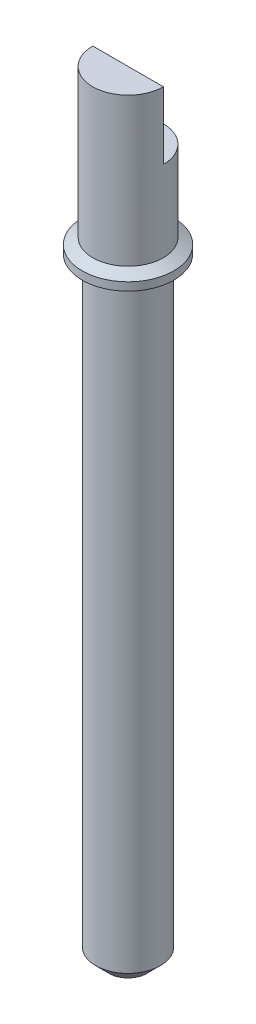
ISO-10303-21;
HEADER;
FILE_DESCRIPTION(('STEP AP214'),'2;1');
FILE_NAME('part.step','',(''),(''),'','','');
FILE_SCHEMA(('AUTOMOTIVE_DESIGN { 1 0 10303 214 1 1 1 1 }'));
ENDSEC;
DATA;
#1=APPLICATION_CONTEXT('core data for automotive mechanical design processes');
#2=APPLICATION_PROTOCOL_DEFINITION('international standard','automotive_design',2000,#1);
#3=PRODUCT_CONTEXT('',#1,'mechanical');
#4=PRODUCT('Part','Part','',(#3));
#5=PRODUCT_RELATED_PRODUCT_CATEGORY('part','',(#4));
#6=PRODUCT_DEFINITION_FORMATION('','',#4);
#7=PRODUCT_DEFINITION_CONTEXT('part definition',#1,'design');
#8=PRODUCT_DEFINITION('design','',#6,#7);
#9=PRODUCT_DEFINITION_SHAPE('','',#8);
#10=(LENGTH_UNIT() NAMED_UNIT(*) SI_UNIT(.MILLI.,.METRE.));
#11=(NAMED_UNIT(*) PLANE_ANGLE_UNIT() SI_UNIT($,.RADIAN.));
#12=(NAMED_UNIT(*) SI_UNIT($,.STERADIAN.) SOLID_ANGLE_UNIT());
#13=UNCERTAINTY_MEASURE_WITH_UNIT(LENGTH_MEASURE(1.E-05),#10,'distance_accuracy_value','');
#14=(GEOMETRIC_REPRESENTATION_CONTEXT(3) GLOBAL_UNCERTAINTY_ASSIGNED_CONTEXT((#13)) GLOBAL_UNIT_ASSIGNED_CONTEXT((#10,
#11,#12)) REPRESENTATION_CONTEXT('',''));
#15=CARTESIAN_POINT('',(0.,0.,0.));
#16=DIRECTION('',(0.,0.,1.));
#17=DIRECTION('',(1.,0.,0.));
#18=AXIS2_PLACEMENT_3D('',#15,#16,#17);
#19=CARTESIAN_POINT('',(0.,24.38641432653,0.));
#20=DIRECTION('',(0.,1.,0.));
#21=DIRECTION('',(0.,0.,1.));
#22=AXIS2_PLACEMENT_3D('',#19,#20,#21);
#23=CONICAL_SURFACE('',#22,0.6,1.04719755119661);
#24=CARTESIAN_POINT('',(0.,24.5307518938274,0.));
#25=DIRECTION('',(0.,-1.,0.));
#26=DIRECTION('',(0.,0.,-1.));
#27=AXIS2_PLACEMENT_3D('',#24,#25,#26);
#28=CIRCLE('',#27,0.85);
#29=CARTESIAN_POINT('',(0.,24.5307518938274,-0.85));
#30=VERTEX_POINT('',#29);
#31=EDGE_CURVE('E11',#30,#30,#28,.T.);
#32=ORIENTED_EDGE('',*,*,#31,.T.);
#33=EDGE_LOOP('',(#32));
#34=FACE_BOUND('',#33,.T.);
#35=CARTESIAN_POINT('',(0.,24.38641432653,0.));
#36=DIRECTION('',(0.,-1.,0.));
#37=DIRECTION('',(0.,0.,-1.));
#38=AXIS2_PLACEMENT_3D('',#35,#36,#37);
#39=CIRCLE('',#38,0.6);
#40=CARTESIAN_POINT('',(0.,24.38641432653,-0.6));
#41=VERTEX_POINT('',#40);
#42=EDGE_CURVE('E391',#41,#41,#39,.T.);
#43=ORIENTED_EDGE('',*,*,#42,.F.);
#44=EDGE_LOOP('',(#43));
#45=FACE_BOUND('',#44,.T.);
#46=ADVANCED_FACE('F354',(#34,#45),#23,.T.);
#47=CARTESIAN_POINT('',(0.,0.,0.));
#48=DIRECTION('',(0.,-1.,0.));
#49=DIRECTION('',(0.,0.,-1.));
#50=AXIS2_PLACEMENT_3D('',#47,#48,#49);
#51=CYLINDRICAL_SURFACE('',#50,0.85);
#52=CARTESIAN_POINT('',(0.,24.6807518938274,0.));
#53=DIRECTION('',(0.,-1.,0.));
#54=DIRECTION('',(0.,0.,-1.));
#55=AXIS2_PLACEMENT_3D('',#52,#53,#54);
#56=CIRCLE('',#55,0.85);
#57=CARTESIAN_POINT('',(0.,24.6807518938274,-0.85));
#58=VERTEX_POINT('',#57);
#59=EDGE_CURVE('E361',#58,#58,#56,.T.);
#60=ORIENTED_EDGE('',*,*,#59,.T.);
#61=EDGE_LOOP('',(#60));
#62=FACE_BOUND('',#61,.T.);
#63=ORIENTED_EDGE('',*,*,#31,.F.);
#64=EDGE_LOOP('',(#63));
#65=FACE_BOUND('',#64,.T.);
#66=ADVANCED_FACE('F406',(#62,#65),#51,.T.);
#67=CARTESIAN_POINT('',(0.,24.6807518938274,0.));
#68=DIRECTION('',(0.,-1.,0.));
#69=DIRECTION('',(0.,0.,-1.));
#70=AXIS2_PLACEMENT_3D('',#67,#68,#69);
#71=CONICAL_SURFACE('',#70,0.85,1.0471975511966);
#72=CARTESIAN_POINT('',(0.,24.7933351963194,0.));
#73=DIRECTION('',(0.,-1.,0.));
#74=DIRECTION('',(0.,0.,-1.));
#75=AXIS2_PLACEMENT_3D('',#72,#73,#74);
#76=CIRCLE('',#75,0.655);
#77=CARTESIAN_POINT('',(0.,24.7933351963194,-0.655));
#78=VERTEX_POINT('',#77);
#79=EDGE_CURVE('E394',#78,#78,#76,.T.);
#80=ORIENTED_EDGE('',*,*,#79,.T.);
#81=EDGE_LOOP('',(#80));
#82=FACE_BOUND('',#81,.T.);
#83=ORIENTED_EDGE('',*,*,#59,.F.);
#84=EDGE_LOOP('',(#83));
#85=FACE_BOUND('',#84,.T.);
#86=ADVANCED_FACE('F409',(#82,#85),#71,.T.);
#87=CARTESIAN_POINT('',(0.,0.,0.));
#88=DIRECTION('',(0.,-1.,0.));
#89=DIRECTION('',(0.,0.,-1.));
#90=AXIS2_PLACEMENT_3D('',#87,#88,#89);
#91=CYLINDRICAL_SURFACE('',#90,0.655);
#92=DIRECTION('',(0.,1.,0.));
#93=VECTOR('',#92,1.);
#94=CARTESIAN_POINT('',(-0.655,26.2933351963193,0.));
#95=LINE('',#94,#93);
#96=CARTESIAN_POINT('',(-0.655,26.2933351963193,0.));
#97=VERTEX_POINT('',#96);
#98=CARTESIAN_POINT('',(-0.655,27.5433351963193,0.));
#99=VERTEX_POINT('',#98);
#100=EDGE_CURVE('E368',#97,#99,#95,.T.);
#101=ORIENTED_EDGE('',*,*,#100,.F.);
#102=CARTESIAN_POINT('',(0.,26.2933351963193,0.));
#103=DIRECTION('',(0.,1.,0.));
#104=DIRECTION('',(0.,0.,1.));
#105=AXIS2_PLACEMENT_3D('',#102,#103,#104);
#106=CIRCLE('',#105,0.655);
#107=CARTESIAN_POINT('',(0.655,26.2933351963193,0.));
#108=VERTEX_POINT('',#107);
#109=EDGE_CURVE('E384',#108,#97,#106,.T.);
#110=ORIENTED_EDGE('',*,*,#109,.F.);
#111=DIRECTION('',(0.,1.,0.));
#112=VECTOR('',#111,1.);
#113=CARTESIAN_POINT('',(0.655,26.2933351963193,0.));
#114=LINE('',#113,#112);
#115=CARTESIAN_POINT('',(0.655,27.5433351963193,0.));
#116=VERTEX_POINT('',#115);
#117=EDGE_CURVE('E373',#108,#116,#114,.T.);
#118=ORIENTED_EDGE('',*,*,#117,.T.);
#119=CARTESIAN_POINT('',(0.,27.5433351963193,0.));
#120=DIRECTION('',(0.,-1.,0.));
#121=DIRECTION('',(0.,0.,-1.));
#122=AXIS2_PLACEMENT_3D('',#119,#120,#121);
#123=CIRCLE('',#122,0.655);
#124=EDGE_CURVE('E390',#116,#99,#123,.T.);
#125=ORIENTED_EDGE('',*,*,#124,.T.);
#126=EDGE_LOOP('',(#101,#110,#118,#125));
#127=FACE_BOUND('',#126,.T.);
#128=ORIENTED_EDGE('',*,*,#79,.F.);
#129=EDGE_LOOP('',(#128));
#130=FACE_BOUND('',#129,.T.);
#131=ADVANCED_FACE('F388',(#127,#130),#91,.T.);
#132=CARTESIAN_POINT('',(0.655,27.5433351963193,0.));
#133=DIRECTION('',(0.,1.,0.));
#134=DIRECTION('',(0.,0.,1.));
#135=AXIS2_PLACEMENT_3D('',#132,#133,#134);
#136=PLANE('',#135);
#137=DIRECTION('',(1.,0.,0.));
#138=VECTOR('',#137,1.);
#139=CARTESIAN_POINT('',(0.655,27.5433351963193,0.));
#140=LINE('',#139,#138);
#141=EDGE_CURVE('E379',#99,#116,#140,.T.);
#142=ORIENTED_EDGE('',*,*,#141,.F.);
#143=ORIENTED_EDGE('',*,*,#124,.F.);
#144=EDGE_LOOP('',(#142,#143));
#145=FACE_BOUND('',#144,.T.);
#146=ADVANCED_FACE('F393',(#145),#136,.T.);
#147=CARTESIAN_POINT('',(0.35,13.13641432653,0.));
#148=DIRECTION('',(0.,-1.,0.));
#149=DIRECTION('',(0.,0.,-1.));
#150=AXIS2_PLACEMENT_3D('',#147,#148,#149);
#151=PLANE('',#150);
#152=CARTESIAN_POINT('',(0.,13.13641432653,0.));
#153=DIRECTION('',(0.,-1.,0.));
#154=DIRECTION('',(0.,0.,-1.));
#155=AXIS2_PLACEMENT_3D('',#152,#153,#154);
#156=CIRCLE('',#155,0.35);
#157=CARTESIAN_POINT('',(0.,13.13641432653,-0.35));
#158=VERTEX_POINT('',#157);
#159=EDGE_CURVE('E395',#158,#158,#156,.T.);
#160=ORIENTED_EDGE('',*,*,#159,.T.);
#161=EDGE_LOOP('',(#160));
#162=FACE_BOUND('',#161,.T.);
#163=ADVANCED_FACE('F449',(#162),#151,.T.);
#164=CARTESIAN_POINT('',(0.,13.13641432653,0.));
#165=DIRECTION('',(0.,1.,0.));
#166=DIRECTION('',(0.,0.,1.));
#167=AXIS2_PLACEMENT_3D('',#164,#165,#166);
#168=CONICAL_SURFACE('',#167,0.35,0.78539816339745);
#169=CARTESIAN_POINT('',(0.,13.38641432653,0.));
#170=DIRECTION('',(0.,-1.,0.));
#171=DIRECTION('',(0.,0.,-1.));
#172=AXIS2_PLACEMENT_3D('',#169,#170,#171);
#173=CIRCLE('',#172,0.600000000000001);
#174=CARTESIAN_POINT('',(0.,13.38641432653,-0.600000000000001));
#175=VERTEX_POINT('',#174);
#176=EDGE_CURVE('E400',#175,#175,#173,.T.);
#177=ORIENTED_EDGE('',*,*,#176,.T.);
#178=EDGE_LOOP('',(#177));
#179=FACE_BOUND('',#178,.T.);
#180=ORIENTED_EDGE('',*,*,#159,.F.);
#181=EDGE_LOOP('',(#180));
#182=FACE_BOUND('',#181,.T.);
#183=ADVANCED_FACE('F446',(#179,#182),#168,.T.);
#184=CARTESIAN_POINT('',(0.,0.,0.));
#185=DIRECTION('',(0.,-1.,0.));
#186=DIRECTION('',(0.,0.,-1.));
#187=AXIS2_PLACEMENT_3D('',#184,#185,#186);
#188=CYLINDRICAL_SURFACE('',#187,0.6);
#189=ORIENTED_EDGE('',*,*,#42,.T.);
#190=EDGE_LOOP('',(#189));
#191=FACE_BOUND('',#190,.T.);
#192=ORIENTED_EDGE('',*,*,#176,.F.);
#193=EDGE_LOOP('',(#192));
#194=FACE_BOUND('',#193,.T.);
#195=ADVANCED_FACE('F441',(#191,#194),#188,.T.);
#196=CARTESIAN_POINT('',(0.655,26.2933351963193,0.));
#197=DIRECTION('',(0.,0.,1.));
#198=DIRECTION('',(1.,0.,0.));
#199=AXIS2_PLACEMENT_3D('',#196,#197,#198);
#200=PLANE('',#199);
#201=ORIENTED_EDGE('',*,*,#141,.T.);
#202=ORIENTED_EDGE('',*,*,#117,.F.);
#203=DIRECTION('',(1.,0.,0.));
#204=VECTOR('',#203,1.);
#205=CARTESIAN_POINT('',(0.655,26.2933351963193,0.));
#206=LINE('',#205,#204);
#207=EDGE_CURVE('E431',#97,#108,#206,.T.);
#208=ORIENTED_EDGE('',*,*,#207,.F.);
#209=ORIENTED_EDGE('',*,*,#100,.T.);
#210=EDGE_LOOP('',(#201,#202,#208,#209));
#211=FACE_BOUND('',#210,.T.);
#212=ADVANCED_FACE('F380',(#211),#200,.F.);
#213=CARTESIAN_POINT('',(0.,26.2933351963193,0.));
#214=DIRECTION('',(0.,1.,0.));
#215=DIRECTION('',(0.,0.,1.));
#216=AXIS2_PLACEMENT_3D('',#213,#214,#215);
#217=PLANE('',#216);
#218=ORIENTED_EDGE('',*,*,#109,.T.);
#219=ORIENTED_EDGE('',*,*,#207,.T.);
#220=EDGE_LOOP('',(#218,#219));
#221=FACE_BOUND('',#220,.T.);
#222=ADVANCED_FACE('F435',(#221),#217,.T.);
#223=CLOSED_SHELL('',(#46,#66,#86,#131,#146,#163,#183,#195,#212,#222));
#224=MANIFOLD_SOLID_BREP('B2',#223);
#225=ADVANCED_BREP_SHAPE_REPRESENTATION('',(#18,#224),#14);
#226=SHAPE_DEFINITION_REPRESENTATION(#9,#225);
ENDSEC;
END-ISO-10303-21;
